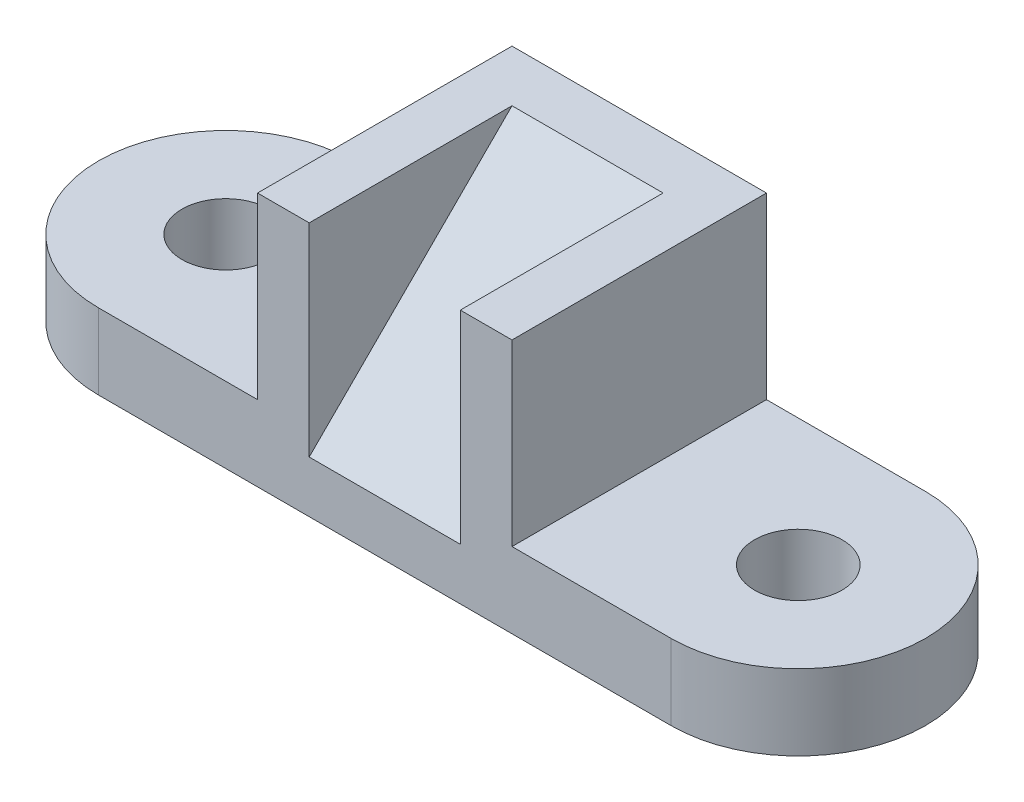
ISO-10303-21;
HEADER;
FILE_DESCRIPTION(('STEP AP214'),'2;1');
FILE_NAME('part.step','',(''),(''),'','','');
FILE_SCHEMA(('AUTOMOTIVE_DESIGN { 1 0 10303 214 1 1 1 1 }'));
ENDSEC;
DATA;
#1=APPLICATION_CONTEXT('core data for automotive mechanical design processes');
#2=APPLICATION_PROTOCOL_DEFINITION('international standard','automotive_design',2000,#1);
#3=PRODUCT_CONTEXT('',#1,'mechanical');
#4=PRODUCT('Part','Part','',(#3));
#5=PRODUCT_RELATED_PRODUCT_CATEGORY('part','',(#4));
#6=PRODUCT_DEFINITION_FORMATION('','',#4);
#7=PRODUCT_DEFINITION_CONTEXT('part definition',#1,'design');
#8=PRODUCT_DEFINITION('design','',#6,#7);
#9=PRODUCT_DEFINITION_SHAPE('','',#8);
#10=(LENGTH_UNIT() NAMED_UNIT(*) SI_UNIT(.MILLI.,.METRE.));
#11=(NAMED_UNIT(*) PLANE_ANGLE_UNIT() SI_UNIT($,.RADIAN.));
#12=(NAMED_UNIT(*) SI_UNIT($,.STERADIAN.) SOLID_ANGLE_UNIT());
#13=UNCERTAINTY_MEASURE_WITH_UNIT(LENGTH_MEASURE(1.E-05),#10,'distance_accuracy_value','');
#14=(GEOMETRIC_REPRESENTATION_CONTEXT(3) GLOBAL_UNCERTAINTY_ASSIGNED_CONTEXT((#13)) GLOBAL_UNIT_ASSIGNED_CONTEXT((#10,
#11,#12)) REPRESENTATION_CONTEXT('',''));
#15=CARTESIAN_POINT('',(0.,0.,0.));
#16=DIRECTION('',(0.,0.,1.));
#17=DIRECTION('',(1.,0.,0.));
#18=AXIS2_PLACEMENT_3D('',#15,#16,#17);
#19=CARTESIAN_POINT('',(-72.,19.,32.));
#20=DIRECTION('',(0.,0.,-1.));
#21=DIRECTION('',(-1.,0.,0.));
#22=AXIS2_PLACEMENT_3D('',#19,#20,#21);
#23=PLANE('',#22);
#24=DIRECTION('',(0.,1.,0.));
#25=VECTOR('',#24,1.);
#26=CARTESIAN_POINT('',(19.,13.,32.));
#27=LINE('',#26,#25);
#28=CARTESIAN_POINT('',(19.,13.,32.));
#29=VERTEX_POINT('',#28);
#30=CARTESIAN_POINT('',(19.,64.,32.));
#31=VERTEX_POINT('',#30);
#32=EDGE_CURVE('E142',#29,#31,#27,.T.);
#33=ORIENTED_EDGE('',*,*,#32,.F.);
#34=DIRECTION('',(-1.,0.,0.));
#35=VECTOR('',#34,1.);
#36=CARTESIAN_POINT('',(19.,13.,32.));
#37=LINE('',#36,#35);
#38=CARTESIAN_POINT('',(-19.,13.,32.));
#39=VERTEX_POINT('',#38);
#40=EDGE_CURVE('E128',#29,#39,#37,.T.);
#41=ORIENTED_EDGE('',*,*,#40,.T.);
#42=DIRECTION('',(0.,1.,0.));
#43=VECTOR('',#42,1.);
#44=CARTESIAN_POINT('',(-19.,13.,32.));
#45=LINE('',#44,#43);
#46=CARTESIAN_POINT('',(-19.,64.,32.));
#47=VERTEX_POINT('',#46);
#48=EDGE_CURVE('E158',#39,#47,#45,.T.);
#49=ORIENTED_EDGE('',*,*,#48,.T.);
#50=DIRECTION('',(1.,0.,0.));
#51=VECTOR('',#50,1.);
#52=CARTESIAN_POINT('',(-32.,64.,32.));
#53=LINE('',#52,#51);
#54=CARTESIAN_POINT('',(-32.,64.,32.));
#55=VERTEX_POINT('',#54);
#56=EDGE_CURVE('E177',#55,#47,#53,.T.);
#57=ORIENTED_EDGE('',*,*,#56,.F.);
#58=DIRECTION('',(0.,-1.,0.));
#59=VECTOR('',#58,1.);
#60=CARTESIAN_POINT('',(-32.,64.,32.));
#61=LINE('',#60,#59);
#62=CARTESIAN_POINT('',(-32.,19.,32.));
#63=VERTEX_POINT('',#62);
#64=EDGE_CURVE('E190',#55,#63,#61,.T.);
#65=ORIENTED_EDGE('',*,*,#64,.T.);
#66=DIRECTION('',(1.,0.,0.));
#67=VECTOR('',#66,1.);
#68=CARTESIAN_POINT('',(-72.,19.,32.));
#69=LINE('',#68,#67);
#70=CARTESIAN_POINT('',(-72.,19.,32.));
#71=VERTEX_POINT('',#70);
#72=EDGE_CURVE('E225',#71,#63,#69,.T.);
#73=ORIENTED_EDGE('',*,*,#72,.F.);
#74=DIRECTION('',(0.,-1.,0.));
#75=VECTOR('',#74,1.);
#76=CARTESIAN_POINT('',(-72.,19.,32.));
#77=LINE('',#76,#75);
#78=CARTESIAN_POINT('',(-72.,0.,32.));
#79=VERTEX_POINT('',#78);
#80=EDGE_CURVE('E11',#71,#79,#77,.T.);
#81=ORIENTED_EDGE('',*,*,#80,.T.);
#82=DIRECTION('',(1.,0.,0.));
#83=VECTOR('',#82,1.);
#84=CARTESIAN_POINT('',(-72.,0.,32.));
#85=LINE('',#84,#83);
#86=CARTESIAN_POINT('',(72.,0.,32.));
#87=VERTEX_POINT('',#86);
#88=EDGE_CURVE('E239',#79,#87,#85,.T.);
#89=ORIENTED_EDGE('',*,*,#88,.T.);
#90=DIRECTION('',(0.,-1.,0.));
#91=VECTOR('',#90,1.);
#92=CARTESIAN_POINT('',(72.,19.,32.));
#93=LINE('',#92,#91);
#94=CARTESIAN_POINT('',(72.,19.,32.));
#95=VERTEX_POINT('',#94);
#96=EDGE_CURVE('E54',#95,#87,#93,.T.);
#97=ORIENTED_EDGE('',*,*,#96,.F.);
#98=CARTESIAN_POINT('',(32.,19.,32.));
#99=VERTEX_POINT('',#98);
#100=EDGE_CURVE('E223',#99,#95,#69,.T.);
#101=ORIENTED_EDGE('',*,*,#100,.F.);
#102=DIRECTION('',(0.,-1.,0.));
#103=VECTOR('',#102,1.);
#104=CARTESIAN_POINT('',(32.,64.,32.));
#105=LINE('',#104,#103);
#106=CARTESIAN_POINT('',(32.,64.,32.));
#107=VERTEX_POINT('',#106);
#108=EDGE_CURVE('E181',#107,#99,#105,.T.);
#109=ORIENTED_EDGE('',*,*,#108,.F.);
#110=EDGE_CURVE('E150',#31,#107,#53,.T.);
#111=ORIENTED_EDGE('',*,*,#110,.F.);
#112=EDGE_LOOP('',(#33,#41,#49,#57,#65,#73,#81,#89,#97,#101,#109,#111));
#113=FACE_BOUND('',#112,.T.);
#114=ADVANCED_FACE('F45',(#113),#23,.F.);
#115=CARTESIAN_POINT('',(0.,64.,0.));
#116=DIRECTION('',(0.,1.,0.));
#117=DIRECTION('',(0.,0.,1.));
#118=AXIS2_PLACEMENT_3D('',#115,#116,#117);
#119=PLANE('',#118);
#120=DIRECTION('',(-1.,0.,0.));
#121=VECTOR('',#120,1.);
#122=CARTESIAN_POINT('',(19.,64.,-19.));
#123=LINE('',#122,#121);
#124=CARTESIAN_POINT('',(19.,64.,-19.));
#125=VERTEX_POINT('',#124);
#126=CARTESIAN_POINT('',(-19.,64.,-19.));
#127=VERTEX_POINT('',#126);
#128=EDGE_CURVE('E137',#125,#127,#123,.T.);
#129=ORIENTED_EDGE('',*,*,#128,.F.);
#130=DIRECTION('',(0.,0.,-1.));
#131=VECTOR('',#130,1.);
#132=CARTESIAN_POINT('',(19.,64.,32.));
#133=LINE('',#132,#131);
#134=EDGE_CURVE('E138',#31,#125,#133,.T.);
#135=ORIENTED_EDGE('',*,*,#134,.F.);
#136=ORIENTED_EDGE('',*,*,#110,.T.);
#137=DIRECTION('',(0.,0.,-1.));
#138=VECTOR('',#137,1.);
#139=CARTESIAN_POINT('',(32.,64.,-32.));
#140=LINE('',#139,#138);
#141=CARTESIAN_POINT('',(32.,64.,-32.));
#142=VERTEX_POINT('',#141);
#143=EDGE_CURVE('E167',#107,#142,#140,.T.);
#144=ORIENTED_EDGE('',*,*,#143,.T.);
#145=DIRECTION('',(-1.,0.,0.));
#146=VECTOR('',#145,1.);
#147=CARTESIAN_POINT('',(-32.,64.,-32.));
#148=LINE('',#147,#146);
#149=CARTESIAN_POINT('',(-32.,64.,-32.));
#150=VERTEX_POINT('',#149);
#151=EDGE_CURVE('E171',#142,#150,#148,.T.);
#152=ORIENTED_EDGE('',*,*,#151,.T.);
#153=DIRECTION('',(0.,0.,1.));
#154=VECTOR('',#153,1.);
#155=CARTESIAN_POINT('',(-32.,64.,-32.));
#156=LINE('',#155,#154);
#157=EDGE_CURVE('E174',#150,#55,#156,.T.);
#158=ORIENTED_EDGE('',*,*,#157,.T.);
#159=ORIENTED_EDGE('',*,*,#56,.T.);
#160=DIRECTION('',(0.,0.,-1.));
#161=VECTOR('',#160,1.);
#162=CARTESIAN_POINT('',(-19.,64.,32.));
#163=LINE('',#162,#161);
#164=EDGE_CURVE('E146',#47,#127,#163,.T.);
#165=ORIENTED_EDGE('',*,*,#164,.T.);
#166=EDGE_LOOP('',(#129,#135,#136,#144,#152,#158,#159,#165));
#167=FACE_BOUND('',#166,.T.);
#168=ADVANCED_FACE('F281',(#167),#119,.T.);
#169=CARTESIAN_POINT('',(-72.,19.,0.));
#170=DIRECTION('',(0.,1.,0.));
#171=DIRECTION('',(0.,0.,1.));
#172=AXIS2_PLACEMENT_3D('',#169,#170,#171);
#173=PLANE('',#172);
#174=DIRECTION('',(0.,0.,-1.));
#175=VECTOR('',#174,1.);
#176=CARTESIAN_POINT('',(32.,19.,-32.));
#177=LINE('',#176,#175);
#178=CARTESIAN_POINT('',(32.,19.,-32.));
#179=VERTEX_POINT('',#178);
#180=EDGE_CURVE('E165',#99,#179,#177,.T.);
#181=ORIENTED_EDGE('',*,*,#180,.F.);
#182=ORIENTED_EDGE('',*,*,#100,.T.);
#183=CARTESIAN_POINT('',(72.,19.,0.));
#184=DIRECTION('',(0.,1.,0.));
#185=DIRECTION('',(0.,0.,1.));
#186=AXIS2_PLACEMENT_3D('',#183,#184,#185);
#187=CIRCLE('',#186,32.);
#188=CARTESIAN_POINT('',(72.,19.,-32.));
#189=VERTEX_POINT('',#188);
#190=EDGE_CURVE('E228',#95,#189,#187,.T.);
#191=ORIENTED_EDGE('',*,*,#190,.T.);
#192=DIRECTION('',(-1.,0.,0.));
#193=VECTOR('',#192,1.);
#194=CARTESIAN_POINT('',(-72.,19.,-32.));
#195=LINE('',#194,#193);
#196=EDGE_CURVE('E232',#189,#179,#195,.T.);
#197=ORIENTED_EDGE('',*,*,#196,.T.);
#198=EDGE_LOOP('',(#181,#182,#191,#197));
#199=FACE_BOUND('',#198,.T.);
#200=CARTESIAN_POINT('',(72.,19.,0.));
#201=DIRECTION('',(0.,1.,0.));
#202=DIRECTION('',(0.,0.,1.));
#203=AXIS2_PLACEMENT_3D('',#200,#201,#202);
#204=CIRCLE('',#203,11.);
#205=CARTESIAN_POINT('',(72.,19.,11.));
#206=VERTEX_POINT('',#205);
#207=EDGE_CURVE('E203',#206,#206,#204,.T.);
#208=ORIENTED_EDGE('',*,*,#207,.F.);
#209=EDGE_LOOP('',(#208));
#210=FACE_BOUND('',#209,.T.);
#211=ADVANCED_FACE('F304',(#199,#210),#173,.T.);
#212=DIRECTION('',(0.,0.,1.));
#213=VECTOR('',#212,1.);
#214=CARTESIAN_POINT('',(-32.,19.,-32.));
#215=LINE('',#214,#213);
#216=CARTESIAN_POINT('',(-32.,19.,-32.));
#217=VERTEX_POINT('',#216);
#218=EDGE_CURVE('E69',#217,#63,#215,.T.);
#219=ORIENTED_EDGE('',*,*,#218,.F.);
#220=CARTESIAN_POINT('',(-72.,19.,-32.));
#221=VERTEX_POINT('',#220);
#222=EDGE_CURVE('E231',#217,#221,#195,.T.);
#223=ORIENTED_EDGE('',*,*,#222,.T.);
#224=CARTESIAN_POINT('',(-72.,19.,0.));
#225=DIRECTION('',(0.,1.,0.));
#226=DIRECTION('',(0.,0.,1.));
#227=AXIS2_PLACEMENT_3D('',#224,#225,#226);
#228=CIRCLE('',#227,32.);
#229=EDGE_CURVE('E219',#221,#71,#228,.T.);
#230=ORIENTED_EDGE('',*,*,#229,.T.);
#231=ORIENTED_EDGE('',*,*,#72,.T.);
#232=EDGE_LOOP('',(#219,#223,#230,#231));
#233=FACE_BOUND('',#232,.T.);
#234=CARTESIAN_POINT('',(-72.,19.,0.));
#235=DIRECTION('',(0.,1.,0.));
#236=DIRECTION('',(0.,0.,1.));
#237=AXIS2_PLACEMENT_3D('',#234,#235,#236);
#238=CIRCLE('',#237,11.);
#239=CARTESIAN_POINT('',(-72.,19.,11.));
#240=VERTEX_POINT('',#239);
#241=EDGE_CURVE('E211',#240,#240,#238,.T.);
#242=ORIENTED_EDGE('',*,*,#241,.F.);
#243=EDGE_LOOP('',(#242));
#244=FACE_BOUND('',#243,.T.);
#245=ADVANCED_FACE('F274',(#233,#244),#173,.T.);
#246=CARTESIAN_POINT('',(-72.,0.,0.));
#247=DIRECTION('',(0.,1.,0.));
#248=DIRECTION('',(0.,0.,1.));
#249=AXIS2_PLACEMENT_3D('',#246,#247,#248);
#250=PLANE('',#249);
#251=CARTESIAN_POINT('',(-72.,0.,0.));
#252=DIRECTION('',(0.,1.,0.));
#253=DIRECTION('',(0.,0.,1.));
#254=AXIS2_PLACEMENT_3D('',#251,#252,#253);
#255=CIRCLE('',#254,32.);
#256=CARTESIAN_POINT('',(-72.,0.,-32.));
#257=VERTEX_POINT('',#256);
#258=EDGE_CURVE('E215',#257,#79,#255,.T.);
#259=ORIENTED_EDGE('',*,*,#258,.F.);
#260=DIRECTION('',(-1.,0.,0.));
#261=VECTOR('',#260,1.);
#262=CARTESIAN_POINT('',(-72.,0.,-32.));
#263=LINE('',#262,#261);
#264=CARTESIAN_POINT('',(72.,0.,-32.));
#265=VERTEX_POINT('',#264);
#266=EDGE_CURVE('E224',#265,#257,#263,.T.);
#267=ORIENTED_EDGE('',*,*,#266,.F.);
#268=CARTESIAN_POINT('',(72.,0.,0.));
#269=DIRECTION('',(0.,1.,0.));
#270=DIRECTION('',(0.,0.,1.));
#271=AXIS2_PLACEMENT_3D('',#268,#269,#270);
#272=CIRCLE('',#271,32.);
#273=EDGE_CURVE('E242',#87,#265,#272,.T.);
#274=ORIENTED_EDGE('',*,*,#273,.F.);
#275=ORIENTED_EDGE('',*,*,#88,.F.);
#276=EDGE_LOOP('',(#259,#267,#274,#275));
#277=FACE_BOUND('',#276,.T.);
#278=CARTESIAN_POINT('',(-72.,0.,0.));
#279=DIRECTION('',(0.,1.,0.));
#280=DIRECTION('',(0.,0.,1.));
#281=AXIS2_PLACEMENT_3D('',#278,#279,#280);
#282=CIRCLE('',#281,11.);
#283=CARTESIAN_POINT('',(-72.,0.,11.));
#284=VERTEX_POINT('',#283);
#285=EDGE_CURVE('E207',#284,#284,#282,.T.);
#286=ORIENTED_EDGE('',*,*,#285,.T.);
#287=EDGE_LOOP('',(#286));
#288=FACE_BOUND('',#287,.T.);
#289=CARTESIAN_POINT('',(72.,0.,0.));
#290=DIRECTION('',(0.,1.,0.));
#291=DIRECTION('',(0.,0.,1.));
#292=AXIS2_PLACEMENT_3D('',#289,#290,#291);
#293=CIRCLE('',#292,11.);
#294=CARTESIAN_POINT('',(72.,0.,11.));
#295=VERTEX_POINT('',#294);
#296=EDGE_CURVE('E202',#295,#295,#293,.T.);
#297=ORIENTED_EDGE('',*,*,#296,.T.);
#298=EDGE_LOOP('',(#297));
#299=FACE_BOUND('',#298,.T.);
#300=ADVANCED_FACE('F265',(#277,#288,#299),#250,.F.);
#301=CARTESIAN_POINT('',(-72.,19.,0.));
#302=DIRECTION('',(0.,-1.,0.));
#303=DIRECTION('',(0.,0.,-1.));
#304=AXIS2_PLACEMENT_3D('',#301,#302,#303);
#305=CYLINDRICAL_SURFACE('',#304,32.);
#306=ORIENTED_EDGE('',*,*,#258,.T.);
#307=ORIENTED_EDGE('',*,*,#80,.F.);
#308=ORIENTED_EDGE('',*,*,#229,.F.);
#309=DIRECTION('',(0.,-1.,0.));
#310=VECTOR('',#309,1.);
#311=CARTESIAN_POINT('',(-72.,19.,-32.));
#312=LINE('',#311,#310);
#313=EDGE_CURVE('E235',#221,#257,#312,.T.);
#314=ORIENTED_EDGE('',*,*,#313,.T.);
#315=EDGE_LOOP('',(#306,#307,#308,#314));
#316=FACE_BOUND('',#315,.T.);
#317=ADVANCED_FACE('F47',(#316),#305,.T.);
#318=CARTESIAN_POINT('',(72.,19.,0.));
#319=DIRECTION('',(0.,-1.,0.));
#320=DIRECTION('',(0.,0.,-1.));
#321=AXIS2_PLACEMENT_3D('',#318,#319,#320);
#322=CYLINDRICAL_SURFACE('',#321,32.);
#323=ORIENTED_EDGE('',*,*,#273,.T.);
#324=DIRECTION('',(0.,-1.,0.));
#325=VECTOR('',#324,1.);
#326=CARTESIAN_POINT('',(72.,19.,-32.));
#327=LINE('',#326,#325);
#328=EDGE_CURVE('E250',#189,#265,#327,.T.);
#329=ORIENTED_EDGE('',*,*,#328,.F.);
#330=ORIENTED_EDGE('',*,*,#190,.F.);
#331=ORIENTED_EDGE('',*,*,#96,.T.);
#332=EDGE_LOOP('',(#323,#329,#330,#331));
#333=FACE_BOUND('',#332,.T.);
#334=ADVANCED_FACE('F259',(#333),#322,.T.);
#335=CARTESIAN_POINT('',(-72.,19.,-32.));
#336=DIRECTION('',(0.,0.,1.));
#337=DIRECTION('',(1.,0.,0.));
#338=AXIS2_PLACEMENT_3D('',#335,#336,#337);
#339=PLANE('',#338);
#340=ORIENTED_EDGE('',*,*,#266,.T.);
#341=ORIENTED_EDGE('',*,*,#313,.F.);
#342=ORIENTED_EDGE('',*,*,#222,.F.);
#343=DIRECTION('',(0.,-1.,0.));
#344=VECTOR('',#343,1.);
#345=CARTESIAN_POINT('',(-32.,64.,-32.));
#346=LINE('',#345,#344);
#347=EDGE_CURVE('E194',#150,#217,#346,.T.);
#348=ORIENTED_EDGE('',*,*,#347,.F.);
#349=ORIENTED_EDGE('',*,*,#151,.F.);
#350=DIRECTION('',(0.,-1.,0.));
#351=VECTOR('',#350,1.);
#352=CARTESIAN_POINT('',(32.,64.,-32.));
#353=LINE('',#352,#351);
#354=EDGE_CURVE('E198',#142,#179,#353,.T.);
#355=ORIENTED_EDGE('',*,*,#354,.T.);
#356=ORIENTED_EDGE('',*,*,#196,.F.);
#357=ORIENTED_EDGE('',*,*,#328,.T.);
#358=EDGE_LOOP('',(#340,#341,#342,#348,#349,#355,#356,#357));
#359=FACE_BOUND('',#358,.T.);
#360=ADVANCED_FACE('F269',(#359),#339,.F.);
#361=CARTESIAN_POINT('',(-72.,19.,0.));
#362=DIRECTION('',(0.,-1.,0.));
#363=DIRECTION('',(0.,0.,-1.));
#364=AXIS2_PLACEMENT_3D('',#361,#362,#363);
#365=CYLINDRICAL_SURFACE('',#364,11.);
#366=ORIENTED_EDGE('',*,*,#241,.T.);
#367=EDGE_LOOP('',(#366));
#368=FACE_BOUND('',#367,.T.);
#369=ORIENTED_EDGE('',*,*,#285,.F.);
#370=EDGE_LOOP('',(#369));
#371=FACE_BOUND('',#370,.T.);
#372=ADVANCED_FACE('F311',(#368,#371),#365,.F.);
#373=CARTESIAN_POINT('',(72.,19.,0.));
#374=DIRECTION('',(0.,-1.,0.));
#375=DIRECTION('',(0.,0.,-1.));
#376=AXIS2_PLACEMENT_3D('',#373,#374,#375);
#377=CYLINDRICAL_SURFACE('',#376,11.);
#378=ORIENTED_EDGE('',*,*,#207,.T.);
#379=EDGE_LOOP('',(#378));
#380=FACE_BOUND('',#379,.T.);
#381=ORIENTED_EDGE('',*,*,#296,.F.);
#382=EDGE_LOOP('',(#381));
#383=FACE_BOUND('',#382,.T.);
#384=ADVANCED_FACE('F318',(#380,#383),#377,.F.);
#385=CARTESIAN_POINT('',(32.,64.,-32.));
#386=DIRECTION('',(-1.,0.,0.));
#387=DIRECTION('',(0.,0.,1.));
#388=AXIS2_PLACEMENT_3D('',#385,#386,#387);
#389=PLANE('',#388);
#390=ORIENTED_EDGE('',*,*,#180,.T.);
#391=ORIENTED_EDGE('',*,*,#354,.F.);
#392=ORIENTED_EDGE('',*,*,#143,.F.);
#393=ORIENTED_EDGE('',*,*,#108,.T.);
#394=EDGE_LOOP('',(#390,#391,#392,#393));
#395=FACE_BOUND('',#394,.T.);
#396=ADVANCED_FACE('F285',(#395),#389,.F.);
#397=CARTESIAN_POINT('',(-32.,64.,-32.));
#398=DIRECTION('',(1.,0.,0.));
#399=DIRECTION('',(0.,0.,-1.));
#400=AXIS2_PLACEMENT_3D('',#397,#398,#399);
#401=PLANE('',#400);
#402=ORIENTED_EDGE('',*,*,#218,.T.);
#403=ORIENTED_EDGE('',*,*,#64,.F.);
#404=ORIENTED_EDGE('',*,*,#157,.F.);
#405=ORIENTED_EDGE('',*,*,#347,.T.);
#406=EDGE_LOOP('',(#402,#403,#404,#405));
#407=FACE_BOUND('',#406,.T.);
#408=ADVANCED_FACE('F290',(#407),#401,.F.);
#409=CARTESIAN_POINT('',(19.,64.,-19.));
#410=DIRECTION('',(0.,-0.707106781186548,-0.707106781186547));
#411=DIRECTION('',(0.,0.707106781186547,-0.707106781186548));
#412=AXIS2_PLACEMENT_3D('',#409,#410,#411);
#413=PLANE('',#412);
#414=DIRECTION('',(0.,-0.707106781186547,0.707106781186548));
#415=VECTOR('',#414,1.);
#416=CARTESIAN_POINT('',(-19.,64.,-19.));
#417=LINE('',#416,#415);
#418=EDGE_CURVE('E61',#127,#39,#417,.T.);
#419=ORIENTED_EDGE('',*,*,#418,.T.);
#420=ORIENTED_EDGE('',*,*,#40,.F.);
#421=DIRECTION('',(0.,-0.707106781186547,0.707106781186548));
#422=VECTOR('',#421,1.);
#423=CARTESIAN_POINT('',(19.,64.,-19.));
#424=LINE('',#423,#422);
#425=EDGE_CURVE('E131',#125,#29,#424,.T.);
#426=ORIENTED_EDGE('',*,*,#425,.F.);
#427=ORIENTED_EDGE('',*,*,#128,.T.);
#428=EDGE_LOOP('',(#419,#420,#426,#427));
#429=FACE_BOUND('',#428,.T.);
#430=ADVANCED_FACE('F130',(#429),#413,.F.);
#431=CARTESIAN_POINT('',(19.,0.,0.));
#432=DIRECTION('',(-1.,0.,0.));
#433=DIRECTION('',(0.,0.,1.));
#434=AXIS2_PLACEMENT_3D('',#431,#432,#433);
#435=PLANE('',#434);
#436=ORIENTED_EDGE('',*,*,#425,.T.);
#437=ORIENTED_EDGE('',*,*,#32,.T.);
#438=ORIENTED_EDGE('',*,*,#134,.T.);
#439=EDGE_LOOP('',(#436,#437,#438));
#440=FACE_BOUND('',#439,.T.);
#441=ADVANCED_FACE('F141',(#440),#435,.T.);
#442=CARTESIAN_POINT('',(-19.,0.,0.));
#443=DIRECTION('',(-1.,0.,0.));
#444=DIRECTION('',(0.,0.,1.));
#445=AXIS2_PLACEMENT_3D('',#442,#443,#444);
#446=PLANE('',#445);
#447=ORIENTED_EDGE('',*,*,#418,.F.);
#448=ORIENTED_EDGE('',*,*,#164,.F.);
#449=ORIENTED_EDGE('',*,*,#48,.F.);
#450=EDGE_LOOP('',(#447,#448,#449));
#451=FACE_BOUND('',#450,.T.);
#452=ADVANCED_FACE('F291',(#451),#446,.F.);
#453=CLOSED_SHELL('',(#114,#168,#211,#245,#300,#317,#334,#360,#372,#384,#396,#408,#430,#441,#452));
#454=MANIFOLD_SOLID_BREP('B2',#453);
#455=ADVANCED_BREP_SHAPE_REPRESENTATION('',(#18,#454),#14);
#456=SHAPE_DEFINITION_REPRESENTATION(#9,#455);
ENDSEC;
END-ISO-10303-21;
